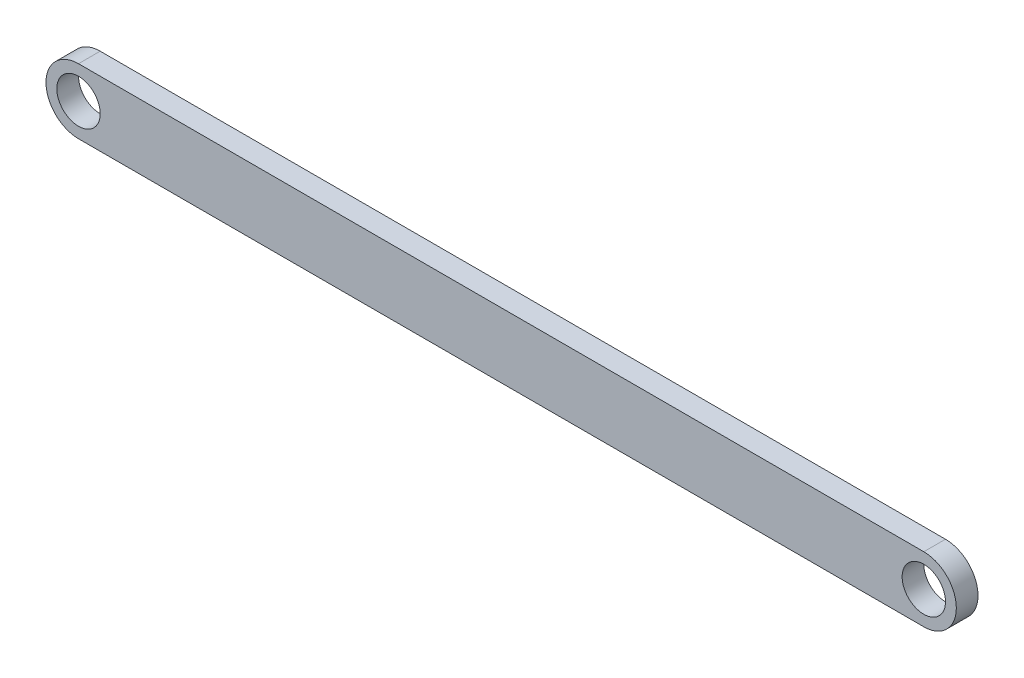
ISO-10303-21;
HEADER;
FILE_DESCRIPTION(('STEP AP214'),'2;1');
FILE_NAME('part.step','',(''),(''),'','','');
FILE_SCHEMA(('AUTOMOTIVE_DESIGN { 1 0 10303 214 1 1 1 1 }'));
ENDSEC;
DATA;
#1=APPLICATION_CONTEXT('core data for automotive mechanical design processes');
#2=APPLICATION_PROTOCOL_DEFINITION('international standard','automotive_design',2000,#1);
#3=PRODUCT_CONTEXT('',#1,'mechanical');
#4=PRODUCT('Part','Part','',(#3));
#5=PRODUCT_RELATED_PRODUCT_CATEGORY('part','',(#4));
#6=PRODUCT_DEFINITION_FORMATION('','',#4);
#7=PRODUCT_DEFINITION_CONTEXT('part definition',#1,'design');
#8=PRODUCT_DEFINITION('design','',#6,#7);
#9=PRODUCT_DEFINITION_SHAPE('','',#8);
#10=(LENGTH_UNIT() NAMED_UNIT(*) SI_UNIT(.MILLI.,.METRE.));
#11=(NAMED_UNIT(*) PLANE_ANGLE_UNIT() SI_UNIT($,.RADIAN.));
#12=(NAMED_UNIT(*) SI_UNIT($,.STERADIAN.) SOLID_ANGLE_UNIT());
#13=UNCERTAINTY_MEASURE_WITH_UNIT(LENGTH_MEASURE(1.E-05),#10,'distance_accuracy_value','');
#14=(GEOMETRIC_REPRESENTATION_CONTEXT(3) GLOBAL_UNCERTAINTY_ASSIGNED_CONTEXT((#13)) GLOBAL_UNIT_ASSIGNED_CONTEXT((#10,
#11,#12)) REPRESENTATION_CONTEXT('',''));
#15=CARTESIAN_POINT('',(0.,0.,0.));
#16=DIRECTION('',(0.,0.,1.));
#17=DIRECTION('',(1.,0.,0.));
#18=AXIS2_PLACEMENT_3D('',#15,#16,#17);
#19=CARTESIAN_POINT('',(0.,0.,10.));
#20=DIRECTION('',(0.,0.,1.));
#21=DIRECTION('',(1.,0.,0.));
#22=AXIS2_PLACEMENT_3D('',#19,#20,#21);
#23=PLANE('',#22);
#24=CARTESIAN_POINT('',(0.,0.,10.));
#25=DIRECTION('',(0.,0.,1.));
#26=DIRECTION('',(1.,0.,0.));
#27=AXIS2_PLACEMENT_3D('',#24,#25,#26);
#28=CIRCLE('',#27,10.);
#29=CARTESIAN_POINT('',(10.,0.,10.));
#30=VERTEX_POINT('',#29);
#31=EDGE_CURVE('E118',#30,#30,#28,.T.);
#32=ORIENTED_EDGE('',*,*,#31,.F.);
#33=EDGE_LOOP('',(#32));
#34=FACE_BOUND('',#33,.T.);
#35=CARTESIAN_POINT('',(0.,0.,10.));
#36=DIRECTION('',(0.,0.,1.));
#37=DIRECTION('',(1.,0.,0.));
#38=AXIS2_PLACEMENT_3D('',#35,#36,#37);
#39=CIRCLE('',#38,15.);
#40=CARTESIAN_POINT('',(0.,15.,10.));
#41=VERTEX_POINT('',#40);
#42=CARTESIAN_POINT('',(0.,-15.,10.));
#43=VERTEX_POINT('',#42);
#44=EDGE_CURVE('E98',#41,#43,#39,.T.);
#45=ORIENTED_EDGE('',*,*,#44,.T.);
#46=DIRECTION('',(1.,0.,0.));
#47=VECTOR('',#46,1.);
#48=CARTESIAN_POINT('',(0.,-15.,10.));
#49=LINE('',#48,#47);
#50=CARTESIAN_POINT('',(390.,-15.,10.));
#51=VERTEX_POINT('',#50);
#52=EDGE_CURVE('E93',#43,#51,#49,.T.);
#53=ORIENTED_EDGE('',*,*,#52,.T.);
#54=CARTESIAN_POINT('',(390.,0.,10.));
#55=DIRECTION('',(0.,0.,1.));
#56=DIRECTION('',(1.,0.,0.));
#57=AXIS2_PLACEMENT_3D('',#54,#55,#56);
#58=CIRCLE('',#57,15.);
#59=CARTESIAN_POINT('',(390.,15.,10.));
#60=VERTEX_POINT('',#59);
#61=EDGE_CURVE('E96',#51,#60,#58,.T.);
#62=ORIENTED_EDGE('',*,*,#61,.T.);
#63=DIRECTION('',(-1.,0.,0.));
#64=VECTOR('',#63,1.);
#65=CARTESIAN_POINT('',(0.,15.,10.));
#66=LINE('',#65,#64);
#67=EDGE_CURVE('E63',#60,#41,#66,.T.);
#68=ORIENTED_EDGE('',*,*,#67,.T.);
#69=EDGE_LOOP('',(#45,#53,#62,#68));
#70=FACE_BOUND('',#69,.T.);
#71=CARTESIAN_POINT('',(390.,0.,10.));
#72=DIRECTION('',(0.,0.,1.));
#73=DIRECTION('',(1.,0.,0.));
#74=AXIS2_PLACEMENT_3D('',#71,#72,#73);
#75=CIRCLE('',#74,9.99999999999998);
#76=CARTESIAN_POINT('',(400.,0.,10.));
#77=VERTEX_POINT('',#76);
#78=EDGE_CURVE('E140',#77,#77,#75,.T.);
#79=ORIENTED_EDGE('',*,*,#78,.F.);
#80=EDGE_LOOP('',(#79));
#81=FACE_BOUND('',#80,.T.);
#82=ADVANCED_FACE('F45',(#34,#70,#81),#23,.T.);
#83=CARTESIAN_POINT('',(0.,0.,0.));
#84=DIRECTION('',(0.,0.,1.));
#85=DIRECTION('',(1.,0.,0.));
#86=AXIS2_PLACEMENT_3D('',#83,#84,#85);
#87=PLANE('',#86);
#88=CARTESIAN_POINT('',(0.,0.,0.));
#89=DIRECTION('',(0.,0.,1.));
#90=DIRECTION('',(1.,0.,0.));
#91=AXIS2_PLACEMENT_3D('',#88,#89,#90);
#92=CIRCLE('',#91,15.);
#93=CARTESIAN_POINT('',(0.,15.,0.));
#94=VERTEX_POINT('',#93);
#95=CARTESIAN_POINT('',(0.,-15.,0.));
#96=VERTEX_POINT('',#95);
#97=EDGE_CURVE('E114',#94,#96,#92,.T.);
#98=ORIENTED_EDGE('',*,*,#97,.F.);
#99=DIRECTION('',(-1.,0.,0.));
#100=VECTOR('',#99,1.);
#101=CARTESIAN_POINT('',(0.,15.,0.));
#102=LINE('',#101,#100);
#103=CARTESIAN_POINT('',(390.,15.,0.));
#104=VERTEX_POINT('',#103);
#105=EDGE_CURVE('E86',#104,#94,#102,.T.);
#106=ORIENTED_EDGE('',*,*,#105,.F.);
#107=CARTESIAN_POINT('',(390.,0.,0.));
#108=DIRECTION('',(0.,0.,1.));
#109=DIRECTION('',(1.,0.,0.));
#110=AXIS2_PLACEMENT_3D('',#107,#108,#109);
#111=CIRCLE('',#110,15.);
#112=CARTESIAN_POINT('',(390.,-15.,0.));
#113=VERTEX_POINT('',#112);
#114=EDGE_CURVE('E80',#113,#104,#111,.T.);
#115=ORIENTED_EDGE('',*,*,#114,.F.);
#116=DIRECTION('',(1.,0.,0.));
#117=VECTOR('',#116,1.);
#118=CARTESIAN_POINT('',(0.,-15.,0.));
#119=LINE('',#118,#117);
#120=EDGE_CURVE('E103',#96,#113,#119,.T.);
#121=ORIENTED_EDGE('',*,*,#120,.F.);
#122=EDGE_LOOP('',(#98,#106,#115,#121));
#123=FACE_BOUND('',#122,.T.);
#124=CARTESIAN_POINT('',(0.,0.,0.));
#125=DIRECTION('',(0.,0.,1.));
#126=DIRECTION('',(1.,0.,0.));
#127=AXIS2_PLACEMENT_3D('',#124,#125,#126);
#128=CIRCLE('',#127,10.);
#129=CARTESIAN_POINT('',(10.,0.,0.));
#130=VERTEX_POINT('',#129);
#131=EDGE_CURVE('E136',#130,#130,#128,.T.);
#132=ORIENTED_EDGE('',*,*,#131,.T.);
#133=EDGE_LOOP('',(#132));
#134=FACE_BOUND('',#133,.T.);
#135=CARTESIAN_POINT('',(390.,0.,0.));
#136=DIRECTION('',(0.,0.,1.));
#137=DIRECTION('',(1.,0.,0.));
#138=AXIS2_PLACEMENT_3D('',#135,#136,#137);
#139=CIRCLE('',#138,9.99999999999998);
#140=CARTESIAN_POINT('',(400.,0.,0.));
#141=VERTEX_POINT('',#140);
#142=EDGE_CURVE('E144',#141,#141,#139,.T.);
#143=ORIENTED_EDGE('',*,*,#142,.T.);
#144=EDGE_LOOP('',(#143));
#145=FACE_BOUND('',#144,.T.);
#146=ADVANCED_FACE('F131',(#123,#134,#145),#87,.F.);
#147=CARTESIAN_POINT('',(0.,0.,10.));
#148=DIRECTION('',(0.,0.,-1.));
#149=DIRECTION('',(-1.,0.,0.));
#150=AXIS2_PLACEMENT_3D('',#147,#148,#149);
#151=CYLINDRICAL_SURFACE('',#150,15.);
#152=ORIENTED_EDGE('',*,*,#97,.T.);
#153=DIRECTION('',(0.,0.,-1.));
#154=VECTOR('',#153,1.);
#155=CARTESIAN_POINT('',(0.,-15.,10.));
#156=LINE('',#155,#154);
#157=EDGE_CURVE('E11',#43,#96,#156,.T.);
#158=ORIENTED_EDGE('',*,*,#157,.F.);
#159=ORIENTED_EDGE('',*,*,#44,.F.);
#160=DIRECTION('',(0.,0.,-1.));
#161=VECTOR('',#160,1.);
#162=CARTESIAN_POINT('',(0.,15.,10.));
#163=LINE('',#162,#161);
#164=EDGE_CURVE('E110',#41,#94,#163,.T.);
#165=ORIENTED_EDGE('',*,*,#164,.T.);
#166=EDGE_LOOP('',(#152,#158,#159,#165));
#167=FACE_BOUND('',#166,.T.);
#168=ADVANCED_FACE('F47',(#167),#151,.T.);
#169=CARTESIAN_POINT('',(0.,-15.,10.));
#170=DIRECTION('',(0.,1.,0.));
#171=DIRECTION('',(0.,0.,1.));
#172=AXIS2_PLACEMENT_3D('',#169,#170,#171);
#173=PLANE('',#172);
#174=ORIENTED_EDGE('',*,*,#120,.T.);
#175=DIRECTION('',(0.,0.,-1.));
#176=VECTOR('',#175,1.);
#177=CARTESIAN_POINT('',(390.,-15.,10.));
#178=LINE('',#177,#176);
#179=EDGE_CURVE('E55',#51,#113,#178,.T.);
#180=ORIENTED_EDGE('',*,*,#179,.F.);
#181=ORIENTED_EDGE('',*,*,#52,.F.);
#182=ORIENTED_EDGE('',*,*,#157,.T.);
#183=EDGE_LOOP('',(#174,#180,#181,#182));
#184=FACE_BOUND('',#183,.T.);
#185=ADVANCED_FACE('F102',(#184),#173,.F.);
#186=CARTESIAN_POINT('',(390.,0.,10.));
#187=DIRECTION('',(0.,0.,-1.));
#188=DIRECTION('',(-1.,0.,0.));
#189=AXIS2_PLACEMENT_3D('',#186,#187,#188);
#190=CYLINDRICAL_SURFACE('',#189,15.);
#191=ORIENTED_EDGE('',*,*,#114,.T.);
#192=DIRECTION('',(0.,0.,-1.));
#193=VECTOR('',#192,1.);
#194=CARTESIAN_POINT('',(390.,15.,10.));
#195=LINE('',#194,#193);
#196=EDGE_CURVE('E105',#60,#104,#195,.T.);
#197=ORIENTED_EDGE('',*,*,#196,.F.);
#198=ORIENTED_EDGE('',*,*,#61,.F.);
#199=ORIENTED_EDGE('',*,*,#179,.T.);
#200=EDGE_LOOP('',(#191,#197,#198,#199));
#201=FACE_BOUND('',#200,.T.);
#202=ADVANCED_FACE('F106',(#201),#190,.T.);
#203=CARTESIAN_POINT('',(0.,15.,10.));
#204=DIRECTION('',(0.,-1.,0.));
#205=DIRECTION('',(0.,0.,-1.));
#206=AXIS2_PLACEMENT_3D('',#203,#204,#205);
#207=PLANE('',#206);
#208=ORIENTED_EDGE('',*,*,#105,.T.);
#209=ORIENTED_EDGE('',*,*,#164,.F.);
#210=ORIENTED_EDGE('',*,*,#67,.F.);
#211=ORIENTED_EDGE('',*,*,#196,.T.);
#212=EDGE_LOOP('',(#208,#209,#210,#211));
#213=FACE_BOUND('',#212,.T.);
#214=ADVANCED_FACE('F128',(#213),#207,.F.);
#215=CARTESIAN_POINT('',(0.,0.,10.));
#216=DIRECTION('',(0.,0.,-1.));
#217=DIRECTION('',(-1.,0.,0.));
#218=AXIS2_PLACEMENT_3D('',#215,#216,#217);
#219=CYLINDRICAL_SURFACE('',#218,10.);
#220=ORIENTED_EDGE('',*,*,#31,.T.);
#221=EDGE_LOOP('',(#220));
#222=FACE_BOUND('',#221,.T.);
#223=ORIENTED_EDGE('',*,*,#131,.F.);
#224=EDGE_LOOP('',(#223));
#225=FACE_BOUND('',#224,.T.);
#226=ADVANCED_FACE('F163',(#222,#225),#219,.F.);
#227=CARTESIAN_POINT('',(390.,0.,10.));
#228=DIRECTION('',(0.,0.,-1.));
#229=DIRECTION('',(-1.,0.,0.));
#230=AXIS2_PLACEMENT_3D('',#227,#228,#229);
#231=CYLINDRICAL_SURFACE('',#230,9.99999999999998);
#232=ORIENTED_EDGE('',*,*,#78,.T.);
#233=EDGE_LOOP('',(#232));
#234=FACE_BOUND('',#233,.T.);
#235=ORIENTED_EDGE('',*,*,#142,.F.);
#236=EDGE_LOOP('',(#235));
#237=FACE_BOUND('',#236,.T.);
#238=ADVANCED_FACE('F152',(#234,#237),#231,.F.);
#239=CLOSED_SHELL('',(#82,#146,#168,#185,#202,#214,#226,#238));
#240=MANIFOLD_SOLID_BREP('B2',#239);
#241=ADVANCED_BREP_SHAPE_REPRESENTATION('',(#18,#240),#14);
#242=SHAPE_DEFINITION_REPRESENTATION(#9,#241);
ENDSEC;
END-ISO-10303-21;
